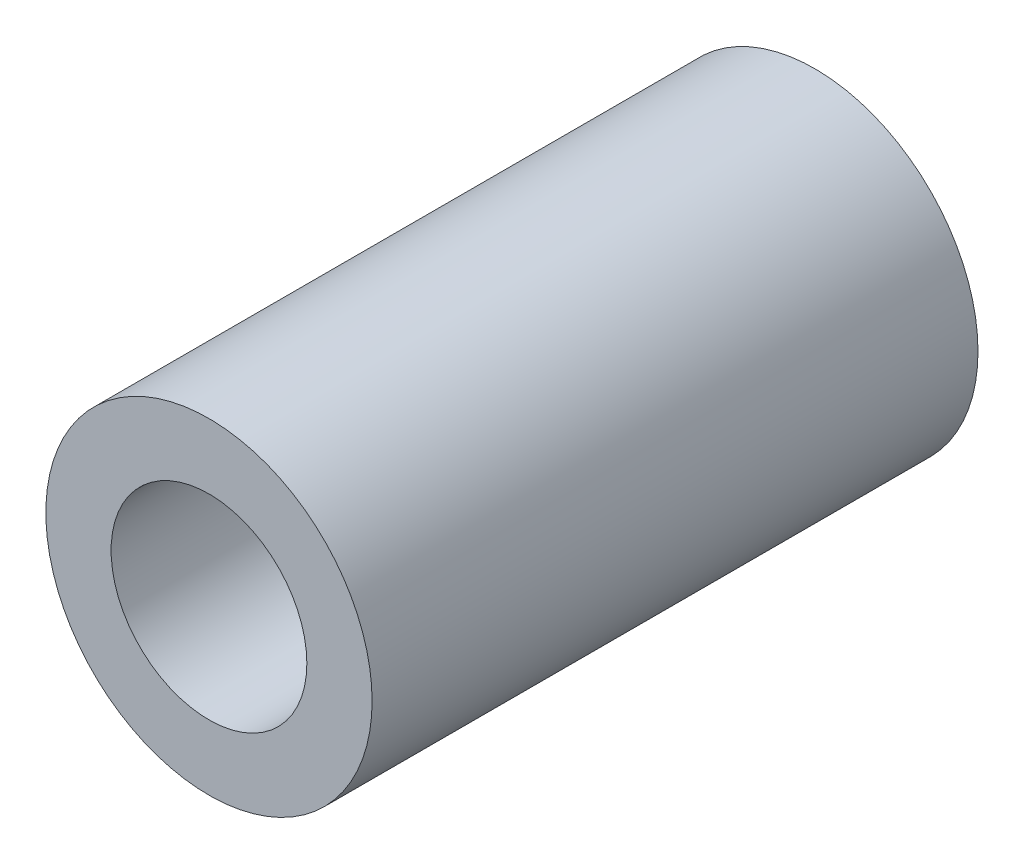
ISO-10303-21;
HEADER;
FILE_DESCRIPTION(('STEP AP214'),'2;1');
FILE_NAME('part.step','',(''),(''),'','','');
FILE_SCHEMA(('AUTOMOTIVE_DESIGN { 1 0 10303 214 1 1 1 1 }'));
ENDSEC;
DATA;
#1=APPLICATION_CONTEXT('core data for automotive mechanical design processes');
#2=APPLICATION_PROTOCOL_DEFINITION('international standard','automotive_design',2000,#1);
#3=PRODUCT_CONTEXT('',#1,'mechanical');
#4=PRODUCT('Part','Part','',(#3));
#5=PRODUCT_RELATED_PRODUCT_CATEGORY('part','',(#4));
#6=PRODUCT_DEFINITION_FORMATION('','',#4);
#7=PRODUCT_DEFINITION_CONTEXT('part definition',#1,'design');
#8=PRODUCT_DEFINITION('design','',#6,#7);
#9=PRODUCT_DEFINITION_SHAPE('','',#8);
#10=(LENGTH_UNIT() NAMED_UNIT(*) SI_UNIT(.MILLI.,.METRE.));
#11=(NAMED_UNIT(*) PLANE_ANGLE_UNIT() SI_UNIT($,.RADIAN.));
#12=(NAMED_UNIT(*) SI_UNIT($,.STERADIAN.) SOLID_ANGLE_UNIT());
#13=UNCERTAINTY_MEASURE_WITH_UNIT(LENGTH_MEASURE(1.E-05),#10,'distance_accuracy_value','');
#14=(GEOMETRIC_REPRESENTATION_CONTEXT(3) GLOBAL_UNCERTAINTY_ASSIGNED_CONTEXT((#13)) GLOBAL_UNIT_ASSIGNED_CONTEXT((#10,
#11,#12)) REPRESENTATION_CONTEXT('',''));
#15=CARTESIAN_POINT('',(0.,0.,0.));
#16=DIRECTION('',(0.,0.,1.));
#17=DIRECTION('',(1.,0.,0.));
#18=AXIS2_PLACEMENT_3D('',#15,#16,#17);
#19=CARTESIAN_POINT('',(0.,0.,13.));
#20=DIRECTION('',(0.,0.,1.));
#21=DIRECTION('',(1.,0.,0.));
#22=AXIS2_PLACEMENT_3D('',#19,#20,#21);
#23=PLANE('',#22);
#24=CARTESIAN_POINT('',(0.,0.,13.));
#25=DIRECTION('',(0.,0.,1.));
#26=DIRECTION('',(1.,0.,0.));
#27=AXIS2_PLACEMENT_3D('',#24,#25,#26);
#28=CIRCLE('',#27,3.5);
#29=CARTESIAN_POINT('',(3.5,0.,13.));
#30=VERTEX_POINT('',#29);
#31=EDGE_CURVE('E10',#30,#30,#28,.T.);
#32=ORIENTED_EDGE('',*,*,#31,.T.);
#33=EDGE_LOOP('',(#32));
#34=FACE_BOUND('',#33,.T.);
#35=CARTESIAN_POINT('',(0.,0.,13.));
#36=DIRECTION('',(0.,0.,1.));
#37=DIRECTION('',(1.,0.,0.));
#38=AXIS2_PLACEMENT_3D('',#35,#36,#37);
#39=CIRCLE('',#38,2.1);
#40=CARTESIAN_POINT('',(2.1,0.,13.));
#41=VERTEX_POINT('',#40);
#42=EDGE_CURVE('E27',#41,#41,#39,.T.);
#43=ORIENTED_EDGE('',*,*,#42,.F.);
#44=EDGE_LOOP('',(#43));
#45=FACE_BOUND('',#44,.T.);
#46=ADVANCED_FACE('F15',(#34,#45),#23,.T.);
#47=CARTESIAN_POINT('',(0.,0.,0.));
#48=DIRECTION('',(0.,0.,1.));
#49=DIRECTION('',(1.,0.,0.));
#50=AXIS2_PLACEMENT_3D('',#47,#48,#49);
#51=PLANE('',#50);
#52=CARTESIAN_POINT('',(0.,0.,0.));
#53=DIRECTION('',(0.,0.,1.));
#54=DIRECTION('',(1.,0.,0.));
#55=AXIS2_PLACEMENT_3D('',#52,#53,#54);
#56=CIRCLE('',#55,3.5);
#57=CARTESIAN_POINT('',(3.5,0.,0.));
#58=VERTEX_POINT('',#57);
#59=EDGE_CURVE('E19',#58,#58,#56,.T.);
#60=ORIENTED_EDGE('',*,*,#59,.F.);
#61=EDGE_LOOP('',(#60));
#62=FACE_BOUND('',#61,.T.);
#63=CARTESIAN_POINT('',(0.,0.,0.));
#64=DIRECTION('',(0.,0.,1.));
#65=DIRECTION('',(1.,0.,0.));
#66=AXIS2_PLACEMENT_3D('',#63,#64,#65);
#67=CIRCLE('',#66,2.1);
#68=CARTESIAN_POINT('',(2.1,0.,0.));
#69=VERTEX_POINT('',#68);
#70=EDGE_CURVE('E29',#69,#69,#67,.T.);
#71=ORIENTED_EDGE('',*,*,#70,.T.);
#72=EDGE_LOOP('',(#71));
#73=FACE_BOUND('',#72,.T.);
#74=ADVANCED_FACE('F36',(#62,#73),#51,.F.);
#75=CARTESIAN_POINT('',(0.,0.,13.));
#76=DIRECTION('',(0.,0.,-1.));
#77=DIRECTION('',(-1.,0.,0.));
#78=AXIS2_PLACEMENT_3D('',#75,#76,#77);
#79=CYLINDRICAL_SURFACE('',#78,3.5);
#80=ORIENTED_EDGE('',*,*,#31,.F.);
#81=EDGE_LOOP('',(#80));
#82=FACE_BOUND('',#81,.T.);
#83=ORIENTED_EDGE('',*,*,#59,.T.);
#84=EDGE_LOOP('',(#83));
#85=FACE_BOUND('',#84,.T.);
#86=ADVANCED_FACE('F17',(#82,#85),#79,.T.);
#87=CARTESIAN_POINT('',(0.,0.,13.));
#88=DIRECTION('',(0.,0.,-1.));
#89=DIRECTION('',(-1.,0.,0.));
#90=AXIS2_PLACEMENT_3D('',#87,#88,#89);
#91=CYLINDRICAL_SURFACE('',#90,2.1);
#92=ORIENTED_EDGE('',*,*,#42,.T.);
#93=EDGE_LOOP('',(#92));
#94=FACE_BOUND('',#93,.T.);
#95=ORIENTED_EDGE('',*,*,#70,.F.);
#96=EDGE_LOOP('',(#95));
#97=FACE_BOUND('',#96,.T.);
#98=ADVANCED_FACE('F35',(#94,#97),#91,.F.);
#99=CLOSED_SHELL('',(#46,#74,#86,#98));
#100=MANIFOLD_SOLID_BREP('B1',#99);
#101=ADVANCED_BREP_SHAPE_REPRESENTATION('',(#18,#100),#14);
#102=SHAPE_DEFINITION_REPRESENTATION(#9,#101);
ENDSEC;
END-ISO-10303-21;
